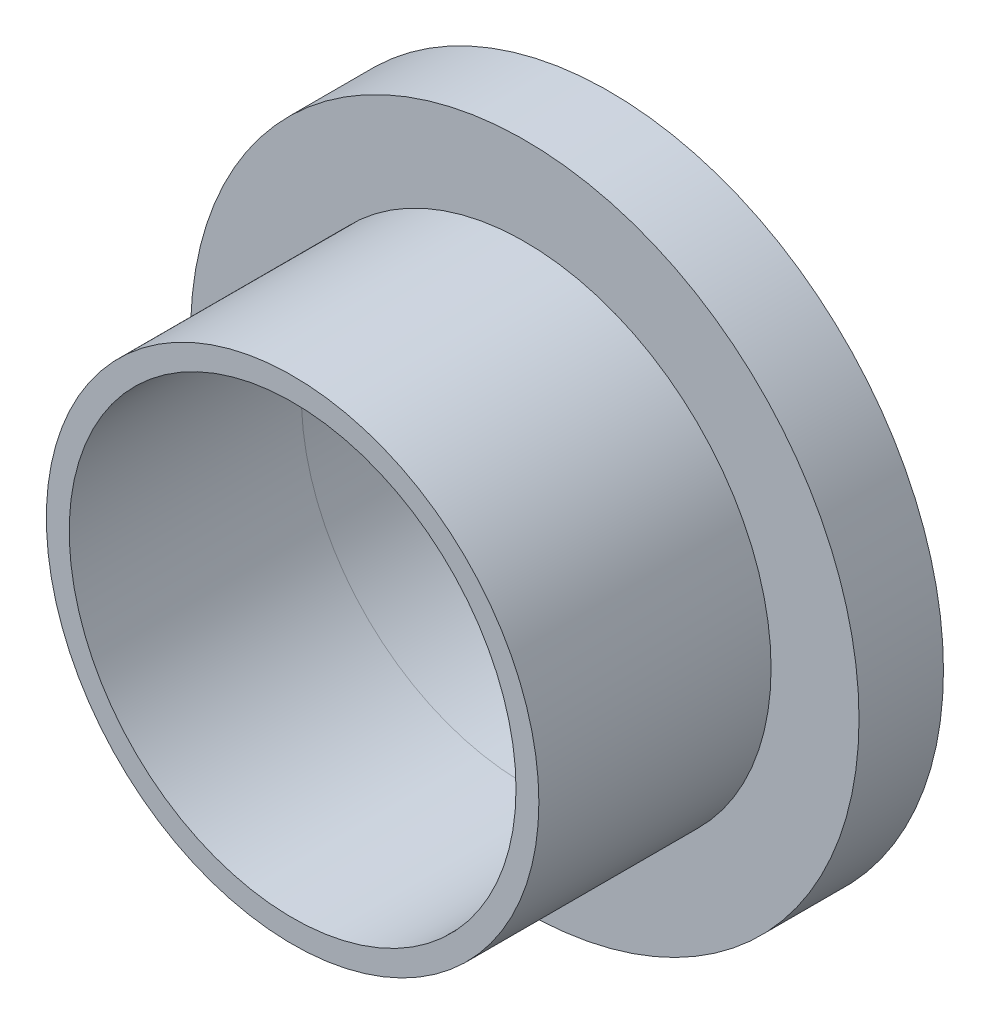
ISO-10303-21;
HEADER;
FILE_DESCRIPTION(('STEP AP214'),'2;1');
FILE_NAME('part.step','',(''),(''),'','','');
FILE_SCHEMA(('AUTOMOTIVE_DESIGN { 1 0 10303 214 1 1 1 1 }'));
ENDSEC;
DATA;
#1=APPLICATION_CONTEXT('core data for automotive mechanical design processes');
#2=APPLICATION_PROTOCOL_DEFINITION('international standard','automotive_design',2000,#1);
#3=PRODUCT_CONTEXT('',#1,'mechanical');
#4=PRODUCT('Part','Part','',(#3));
#5=PRODUCT_RELATED_PRODUCT_CATEGORY('part','',(#4));
#6=PRODUCT_DEFINITION_FORMATION('','',#4);
#7=PRODUCT_DEFINITION_CONTEXT('part definition',#1,'design');
#8=PRODUCT_DEFINITION('design','',#6,#7);
#9=PRODUCT_DEFINITION_SHAPE('','',#8);
#10=(LENGTH_UNIT() NAMED_UNIT(*) SI_UNIT(.MILLI.,.METRE.));
#11=(NAMED_UNIT(*) PLANE_ANGLE_UNIT() SI_UNIT($,.RADIAN.));
#12=(NAMED_UNIT(*) SI_UNIT($,.STERADIAN.) SOLID_ANGLE_UNIT());
#13=UNCERTAINTY_MEASURE_WITH_UNIT(LENGTH_MEASURE(1.E-05),#10,'distance_accuracy_value','');
#14=(GEOMETRIC_REPRESENTATION_CONTEXT(3) GLOBAL_UNCERTAINTY_ASSIGNED_CONTEXT((#13)) GLOBAL_UNIT_ASSIGNED_CONTEXT((#10,
#11,#12)) REPRESENTATION_CONTEXT('',''));
#15=CARTESIAN_POINT('',(0.,0.,0.));
#16=DIRECTION('',(0.,0.,1.));
#17=DIRECTION('',(1.,0.,0.));
#18=AXIS2_PLACEMENT_3D('',#15,#16,#17);
#19=CARTESIAN_POINT('',(0.,0.,-45.));
#20=DIRECTION('',(0.,0.,1.));
#21=DIRECTION('',(1.,0.,0.));
#22=AXIS2_PLACEMENT_3D('',#19,#20,#21);
#23=PLANE('',#22);
#24=CARTESIAN_POINT('',(0.,0.,-45.));
#25=DIRECTION('',(0.,0.,1.));
#26=DIRECTION('',(1.,0.,0.));
#27=AXIS2_PLACEMENT_3D('',#24,#25,#26);
#28=CIRCLE('',#27,31.75);
#29=CARTESIAN_POINT('',(31.75,0.,-45.));
#30=VERTEX_POINT('',#29);
#31=EDGE_CURVE('E10',#30,#30,#28,.T.);
#32=ORIENTED_EDGE('',*,*,#31,.T.);
#33=EDGE_LOOP('',(#32));
#34=FACE_BOUND('',#33,.T.);
#35=CARTESIAN_POINT('',(0.,0.,-45.));
#36=DIRECTION('',(0.,0.,1.));
#37=DIRECTION('',(1.,0.,0.));
#38=AXIS2_PLACEMENT_3D('',#35,#36,#37);
#39=CIRCLE('',#38,47.5);
#40=CARTESIAN_POINT('',(47.5,0.,-45.));
#41=VERTEX_POINT('',#40);
#42=EDGE_CURVE('E44',#41,#41,#39,.T.);
#43=ORIENTED_EDGE('',*,*,#42,.F.);
#44=EDGE_LOOP('',(#43));
#45=FACE_BOUND('',#44,.T.);
#46=ADVANCED_FACE('F16',(#34,#45),#23,.F.);
#47=CARTESIAN_POINT('',(0.,0.,-45.));
#48=DIRECTION('',(0.,0.,1.));
#49=DIRECTION('',(1.,0.,0.));
#50=AXIS2_PLACEMENT_3D('',#47,#48,#49);
#51=CYLINDRICAL_SURFACE('',#50,31.75);
#52=DIRECTION('',(0.,0.,1.));
#53=VECTOR('',#52,1.);
#54=CARTESIAN_POINT('',(31.75,0.,-45.));
#55=LINE('',#54,#53);
#56=CARTESIAN_POINT('',(31.75,0.,-33.));
#57=VERTEX_POINT('',#56);
#58=EDGE_CURVE('E26',#30,#57,#55,.T.);
#59=ORIENTED_EDGE('',*,*,#58,.F.);
#60=ORIENTED_EDGE('',*,*,#31,.F.);
#61=ORIENTED_EDGE('',*,*,#58,.T.);
#62=CARTESIAN_POINT('',(0.,0.,-33.));
#63=DIRECTION('',(0.,0.,1.));
#64=DIRECTION('',(1.,0.,0.));
#65=AXIS2_PLACEMENT_3D('',#62,#63,#64);
#66=CIRCLE('',#65,31.75);
#67=EDGE_CURVE('E72',#57,#57,#66,.T.);
#68=ORIENTED_EDGE('',*,*,#67,.T.);
#69=EDGE_LOOP('',(#59,#60,#61,#68));
#70=FACE_BOUND('',#69,.T.);
#71=ADVANCED_FACE('F102',(#70),#51,.F.);
#72=CARTESIAN_POINT('',(0.,0.,-45.));
#73=DIRECTION('',(0.,0.,1.));
#74=DIRECTION('',(1.,0.,0.));
#75=AXIS2_PLACEMENT_3D('',#72,#73,#74);
#76=CYLINDRICAL_SURFACE('',#75,47.5);
#77=CARTESIAN_POINT('',(0.,0.,-33.));
#78=DIRECTION('',(0.,0.,1.));
#79=DIRECTION('',(1.,0.,0.));
#80=AXIS2_PLACEMENT_3D('',#77,#78,#79);
#81=CIRCLE('',#80,47.5);
#82=CARTESIAN_POINT('',(47.5,0.,-33.));
#83=VERTEX_POINT('',#82);
#84=EDGE_CURVE('E74',#83,#83,#81,.T.);
#85=ORIENTED_EDGE('',*,*,#84,.F.);
#86=DIRECTION('',(0.,0.,1.));
#87=VECTOR('',#86,1.);
#88=CARTESIAN_POINT('',(47.5,0.,-45.));
#89=LINE('',#88,#87);
#90=EDGE_CURVE('E79',#41,#83,#89,.T.);
#91=ORIENTED_EDGE('',*,*,#90,.F.);
#92=ORIENTED_EDGE('',*,*,#42,.T.);
#93=ORIENTED_EDGE('',*,*,#90,.T.);
#94=EDGE_LOOP('',(#85,#91,#92,#93));
#95=FACE_BOUND('',#94,.T.);
#96=ADVANCED_FACE('F104',(#95),#76,.T.);
#97=CARTESIAN_POINT('',(0.,0.,-33.));
#98=DIRECTION('',(0.,0.,1.));
#99=DIRECTION('',(1.,0.,0.));
#100=AXIS2_PLACEMENT_3D('',#97,#98,#99);
#101=CYLINDRICAL_SURFACE('',#100,31.75);
#102=DIRECTION('',(0.,0.,1.));
#103=VECTOR('',#102,1.);
#104=CARTESIAN_POINT('',(31.75,0.,-33.));
#105=LINE('',#104,#103);
#106=CARTESIAN_POINT('',(31.75,0.,0.));
#107=VERTEX_POINT('',#106);
#108=EDGE_CURVE('E68',#57,#107,#105,.T.);
#109=ORIENTED_EDGE('',*,*,#108,.F.);
#110=ORIENTED_EDGE('',*,*,#67,.F.);
#111=ORIENTED_EDGE('',*,*,#108,.T.);
#112=CARTESIAN_POINT('',(0.,0.,0.));
#113=DIRECTION('',(0.,0.,1.));
#114=DIRECTION('',(1.,0.,0.));
#115=AXIS2_PLACEMENT_3D('',#112,#113,#114);
#116=CIRCLE('',#115,31.75);
#117=EDGE_CURVE('E20',#107,#107,#116,.T.);
#118=ORIENTED_EDGE('',*,*,#117,.T.);
#119=EDGE_LOOP('',(#109,#110,#111,#118));
#120=FACE_BOUND('',#119,.T.);
#121=ADVANCED_FACE('F69',(#120),#101,.F.);
#122=CARTESIAN_POINT('',(0.,0.,-33.));
#123=DIRECTION('',(0.,0.,1.));
#124=DIRECTION('',(1.,0.,0.));
#125=AXIS2_PLACEMENT_3D('',#122,#123,#124);
#126=PLANE('',#125);
#127=CARTESIAN_POINT('',(0.,0.,-33.));
#128=DIRECTION('',(0.,0.,1.));
#129=DIRECTION('',(1.,0.,0.));
#130=AXIS2_PLACEMENT_3D('',#127,#128,#129);
#131=CIRCLE('',#130,35.);
#132=CARTESIAN_POINT('',(35.,0.,-33.));
#133=VERTEX_POINT('',#132);
#134=EDGE_CURVE('E93',#133,#133,#131,.T.);
#135=ORIENTED_EDGE('',*,*,#134,.F.);
#136=EDGE_LOOP('',(#135));
#137=FACE_BOUND('',#136,.T.);
#138=ORIENTED_EDGE('',*,*,#84,.T.);
#139=EDGE_LOOP('',(#138));
#140=FACE_BOUND('',#139,.T.);
#141=ADVANCED_FACE('F18',(#137,#140),#126,.T.);
#142=CARTESIAN_POINT('',(0.,0.,0.));
#143=DIRECTION('',(0.,0.,1.));
#144=DIRECTION('',(1.,0.,0.));
#145=AXIS2_PLACEMENT_3D('',#142,#143,#144);
#146=PLANE('',#145);
#147=ORIENTED_EDGE('',*,*,#117,.F.);
#148=EDGE_LOOP('',(#147));
#149=FACE_BOUND('',#148,.T.);
#150=CARTESIAN_POINT('',(0.,0.,0.));
#151=DIRECTION('',(0.,0.,1.));
#152=DIRECTION('',(1.,0.,0.));
#153=AXIS2_PLACEMENT_3D('',#150,#151,#152);
#154=CIRCLE('',#153,35.);
#155=CARTESIAN_POINT('',(35.,0.,0.));
#156=VERTEX_POINT('',#155);
#157=EDGE_CURVE('E86',#156,#156,#154,.T.);
#158=ORIENTED_EDGE('',*,*,#157,.T.);
#159=EDGE_LOOP('',(#158));
#160=FACE_BOUND('',#159,.T.);
#161=ADVANCED_FACE('F117',(#149,#160),#146,.T.);
#162=CARTESIAN_POINT('',(0.,0.,-33.));
#163=DIRECTION('',(0.,0.,1.));
#164=DIRECTION('',(1.,0.,0.));
#165=AXIS2_PLACEMENT_3D('',#162,#163,#164);
#166=CYLINDRICAL_SURFACE('',#165,35.);
#167=ORIENTED_EDGE('',*,*,#157,.F.);
#168=DIRECTION('',(0.,0.,1.));
#169=VECTOR('',#168,1.);
#170=CARTESIAN_POINT('',(35.,0.,-33.));
#171=LINE('',#170,#169);
#172=EDGE_CURVE('E90',#133,#156,#171,.T.);
#173=ORIENTED_EDGE('',*,*,#172,.F.);
#174=ORIENTED_EDGE('',*,*,#134,.T.);
#175=ORIENTED_EDGE('',*,*,#172,.T.);
#176=EDGE_LOOP('',(#167,#173,#174,#175));
#177=FACE_BOUND('',#176,.T.);
#178=ADVANCED_FACE('F114',(#177),#166,.T.);
#179=CLOSED_SHELL('',(#46,#71,#96,#121,#141,#161,#178));
#180=MANIFOLD_SOLID_BREP('B1',#179);
#181=ADVANCED_BREP_SHAPE_REPRESENTATION('',(#18,#180),#14);
#182=SHAPE_DEFINITION_REPRESENTATION(#9,#181);
ENDSEC;
END-ISO-10303-21;
